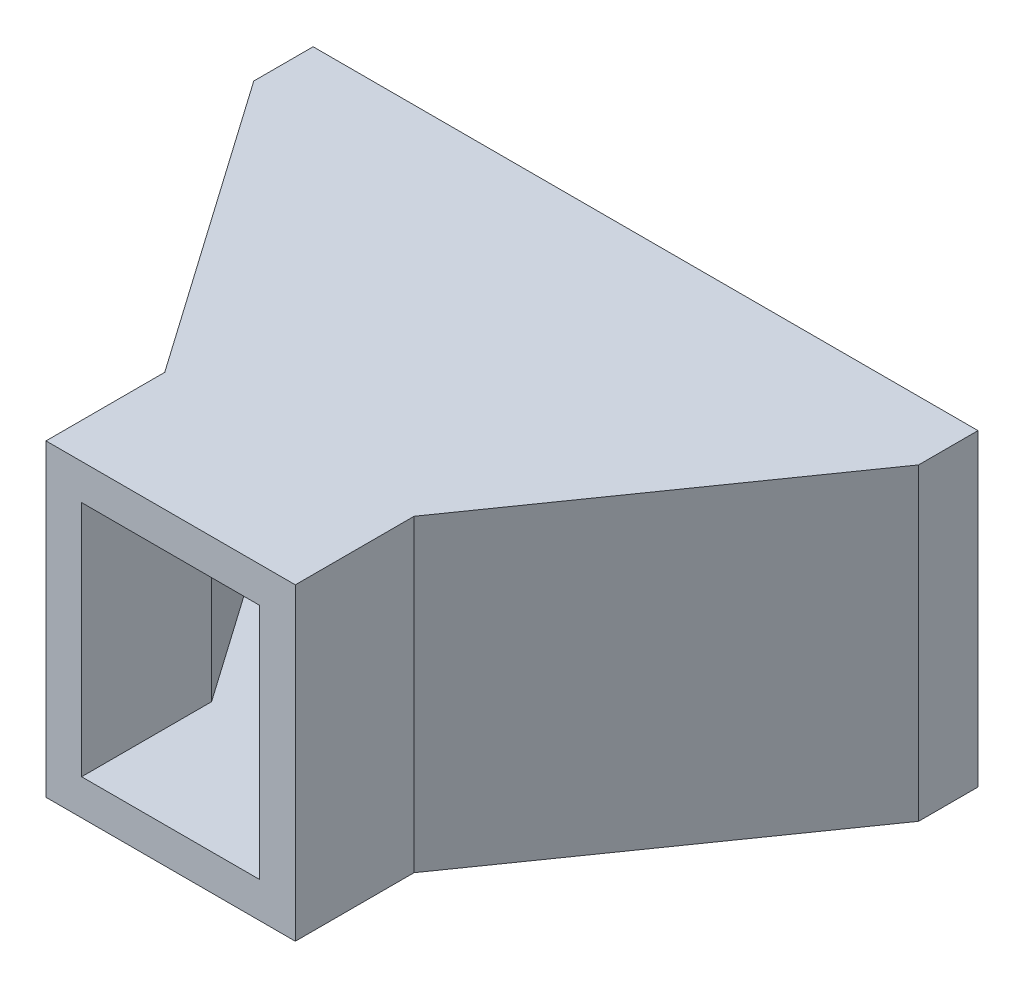
ISO-10303-21;
HEADER;
FILE_DESCRIPTION(('STEP AP214'),'2;1');
FILE_NAME('part.step','',(''),(''),'','','');
FILE_SCHEMA(('AUTOMOTIVE_DESIGN { 1 0 10303 214 1 1 1 1 }'));
ENDSEC;
DATA;
#1=APPLICATION_CONTEXT('core data for automotive mechanical design processes');
#2=APPLICATION_PROTOCOL_DEFINITION('international standard','automotive_design',2000,#1);
#3=PRODUCT_CONTEXT('',#1,'mechanical');
#4=PRODUCT('Part','Part','',(#3));
#5=PRODUCT_RELATED_PRODUCT_CATEGORY('part','',(#4));
#6=PRODUCT_DEFINITION_FORMATION('','',#4);
#7=PRODUCT_DEFINITION_CONTEXT('part definition',#1,'design');
#8=PRODUCT_DEFINITION('design','',#6,#7);
#9=PRODUCT_DEFINITION_SHAPE('','',#8);
#10=(LENGTH_UNIT() NAMED_UNIT(*) SI_UNIT(.MILLI.,.METRE.));
#11=(NAMED_UNIT(*) PLANE_ANGLE_UNIT() SI_UNIT($,.RADIAN.));
#12=(NAMED_UNIT(*) SI_UNIT($,.STERADIAN.) SOLID_ANGLE_UNIT());
#13=UNCERTAINTY_MEASURE_WITH_UNIT(LENGTH_MEASURE(1.E-05),#10,'distance_accuracy_value','');
#14=(GEOMETRIC_REPRESENTATION_CONTEXT(3) GLOBAL_UNCERTAINTY_ASSIGNED_CONTEXT((#13)) GLOBAL_UNIT_ASSIGNED_CONTEXT((#10,
#11,#12)) REPRESENTATION_CONTEXT('',''));
#15=CARTESIAN_POINT('',(0.,0.,0.));
#16=DIRECTION('',(0.,0.,1.));
#17=DIRECTION('',(1.,0.,0.));
#18=AXIS2_PLACEMENT_3D('',#15,#16,#17);
#19=CARTESIAN_POINT('',(0.,20.,0.));
#20=DIRECTION('',(0.,1.,0.));
#21=DIRECTION('',(0.,0.,1.));
#22=AXIS2_PLACEMENT_3D('',#19,#20,#21);
#23=PLANE('',#22);
#24=DIRECTION('',(0.,0.,1.));
#25=VECTOR('',#24,1.);
#26=CARTESIAN_POINT('',(7.5,20.,11.6630289597167));
#27=LINE('',#26,#25);
#28=CARTESIAN_POINT('',(7.5,20.,11.6630289597167));
#29=VERTEX_POINT('',#28);
#30=CARTESIAN_POINT('',(7.5,20.,22.608695652174));
#31=VERTEX_POINT('',#30);
#32=EDGE_CURVE('E252',#29,#31,#27,.T.);
#33=ORIENTED_EDGE('',*,*,#32,.T.);
#34=DIRECTION('',(1.,0.,0.));
#35=VECTOR('',#34,1.);
#36=CARTESIAN_POINT('',(-10.5,20.,22.608695652174));
#37=LINE('',#36,#35);
#38=CARTESIAN_POINT('',(-7.5,20.,22.608695652174));
#39=VERTEX_POINT('',#38);
#40=EDGE_CURVE('E248',#39,#31,#37,.T.);
#41=ORIENTED_EDGE('',*,*,#40,.F.);
#42=DIRECTION('',(0.,0.,-1.));
#43=VECTOR('',#42,1.);
#44=CARTESIAN_POINT('',(-7.5,20.,11.6630289597167));
#45=LINE('',#44,#43);
#46=CARTESIAN_POINT('',(-7.5,20.,11.6630289597167));
#47=VERTEX_POINT('',#46);
#48=EDGE_CURVE('E299',#39,#47,#45,.T.);
#49=ORIENTED_EDGE('',*,*,#48,.T.);
#50=DIRECTION('',(-0.573462344363329,0.,-0.81923192051904));
#51=VECTOR('',#50,1.);
#52=CARTESIAN_POINT('',(-25.,20.,-13.3369710402833));
#53=LINE('',#52,#51);
#54=CARTESIAN_POINT('',(-25.,20.,-13.3369710402833));
#55=VERTEX_POINT('',#54);
#56=EDGE_CURVE('E303',#47,#55,#53,.T.);
#57=ORIENTED_EDGE('',*,*,#56,.T.);
#58=DIRECTION('',(0.,0.,-1.));
#59=VECTOR('',#58,1.);
#60=CARTESIAN_POINT('',(-25.,20.,-17.391304347826));
#61=LINE('',#60,#59);
#62=CARTESIAN_POINT('',(-25.,20.,-17.391304347826));
#63=VERTEX_POINT('',#62);
#64=EDGE_CURVE('E308',#55,#63,#61,.T.);
#65=ORIENTED_EDGE('',*,*,#64,.T.);
#66=DIRECTION('',(-1.,0.,0.));
#67=VECTOR('',#66,1.);
#68=CARTESIAN_POINT('',(28.,20.,-17.391304347826));
#69=LINE('',#68,#67);
#70=CARTESIAN_POINT('',(25.,20.,-17.391304347826));
#71=VERTEX_POINT('',#70);
#72=EDGE_CURVE('E264',#71,#63,#69,.T.);
#73=ORIENTED_EDGE('',*,*,#72,.F.);
#74=DIRECTION('',(0.,0.,1.));
#75=VECTOR('',#74,1.);
#76=CARTESIAN_POINT('',(25.,20.,-17.391304347826));
#77=LINE('',#76,#75);
#78=CARTESIAN_POINT('',(25.,20.,-13.3369710402833));
#79=VERTEX_POINT('',#78);
#80=EDGE_CURVE('E234',#71,#79,#77,.T.);
#81=ORIENTED_EDGE('',*,*,#80,.T.);
#82=DIRECTION('',(-0.573462344363329,0.,0.81923192051904));
#83=VECTOR('',#82,1.);
#84=CARTESIAN_POINT('',(25.,20.,-13.3369710402833));
#85=LINE('',#84,#83);
#86=EDGE_CURVE('E240',#79,#29,#85,.T.);
#87=ORIENTED_EDGE('',*,*,#86,.T.);
#88=EDGE_LOOP('',(#33,#41,#49,#57,#65,#73,#81,#87));
#89=FACE_BOUND('',#88,.T.);
#90=ADVANCED_FACE('F43',(#89),#23,.F.);
#91=CARTESIAN_POINT('',(-28.,20.,-17.391304347826));
#92=DIRECTION('',(0.,0.,1.));
#93=DIRECTION('',(1.,0.,0.));
#94=AXIS2_PLACEMENT_3D('',#91,#92,#93);
#95=PLANE('',#94);
#96=DIRECTION('',(1.,0.,0.));
#97=VECTOR('',#96,1.);
#98=CARTESIAN_POINT('',(0.,-3.,-17.391304347826));
#99=LINE('',#98,#97);
#100=CARTESIAN_POINT('',(-28.,-3.,-17.391304347826));
#101=VERTEX_POINT('',#100);
#102=CARTESIAN_POINT('',(28.,-3.,-17.391304347826));
#103=VERTEX_POINT('',#102);
#104=EDGE_CURVE('E164',#101,#103,#99,.T.);
#105=ORIENTED_EDGE('',*,*,#104,.F.);
#106=DIRECTION('',(0.,-1.,0.));
#107=VECTOR('',#106,1.);
#108=CARTESIAN_POINT('',(-28.,20.,-17.391304347826));
#109=LINE('',#108,#107);
#110=CARTESIAN_POINT('',(-28.,23.,-17.391304347826));
#111=VERTEX_POINT('',#110);
#112=EDGE_CURVE('E11',#111,#101,#109,.T.);
#113=ORIENTED_EDGE('',*,*,#112,.F.);
#114=DIRECTION('',(-1.,0.,0.));
#115=VECTOR('',#114,1.);
#116=CARTESIAN_POINT('',(28.,23.,-17.391304347826));
#117=LINE('',#116,#115);
#118=CARTESIAN_POINT('',(28.,23.,-17.391304347826));
#119=VERTEX_POINT('',#118);
#120=EDGE_CURVE('E166',#119,#111,#117,.T.);
#121=ORIENTED_EDGE('',*,*,#120,.F.);
#122=DIRECTION('',(0.,-1.,0.));
#123=VECTOR('',#122,1.);
#124=CARTESIAN_POINT('',(28.,23.,-17.391304347826));
#125=LINE('',#124,#123);
#126=EDGE_CURVE('E160',#119,#103,#125,.T.);
#127=ORIENTED_EDGE('',*,*,#126,.T.);
#128=EDGE_LOOP('',(#105,#113,#121,#127));
#129=FACE_BOUND('',#128,.T.);
#130=DIRECTION('',(0.,-1.,0.));
#131=VECTOR('',#130,1.);
#132=CARTESIAN_POINT('',(-25.,20.,-17.391304347826));
#133=LINE('',#132,#131);
#134=CARTESIAN_POINT('',(-25.,0.,-17.391304347826));
#135=VERTEX_POINT('',#134);
#136=EDGE_CURVE('E312',#63,#135,#133,.T.);
#137=ORIENTED_EDGE('',*,*,#136,.T.);
#138=DIRECTION('',(1.,0.,0.));
#139=VECTOR('',#138,1.);
#140=CARTESIAN_POINT('',(0.,0.,-17.391304347826));
#141=LINE('',#140,#139);
#142=CARTESIAN_POINT('',(25.,0.,-17.391304347826));
#143=VERTEX_POINT('',#142);
#144=EDGE_CURVE('E193',#135,#143,#141,.T.);
#145=ORIENTED_EDGE('',*,*,#144,.T.);
#146=DIRECTION('',(0.,-1.,0.));
#147=VECTOR('',#146,1.);
#148=CARTESIAN_POINT('',(25.,20.,-17.391304347826));
#149=LINE('',#148,#147);
#150=EDGE_CURVE('E226',#71,#143,#149,.T.);
#151=ORIENTED_EDGE('',*,*,#150,.F.);
#152=ORIENTED_EDGE('',*,*,#72,.T.);
#153=EDGE_LOOP('',(#137,#145,#151,#152));
#154=FACE_BOUND('',#153,.T.);
#155=ADVANCED_FACE('F45',(#129,#154),#95,.F.);
#156=CARTESIAN_POINT('',(-28.,20.,-12.391304347826));
#157=DIRECTION('',(1.,0.,0.));
#158=DIRECTION('',(0.,0.,-1.));
#159=AXIS2_PLACEMENT_3D('',#156,#157,#158);
#160=PLANE('',#159);
#161=ORIENTED_EDGE('',*,*,#112,.T.);
#162=DIRECTION('',(0.,0.,-1.));
#163=VECTOR('',#162,1.);
#164=CARTESIAN_POINT('',(-28.,-3.,0.));
#165=LINE('',#164,#163);
#166=CARTESIAN_POINT('',(-28.,-3.,-12.391304347826));
#167=VERTEX_POINT('',#166);
#168=EDGE_CURVE('E187',#167,#101,#165,.T.);
#169=ORIENTED_EDGE('',*,*,#168,.F.);
#170=DIRECTION('',(0.,-1.,0.));
#171=VECTOR('',#170,1.);
#172=CARTESIAN_POINT('',(-28.,20.,-12.391304347826));
#173=LINE('',#172,#171);
#174=CARTESIAN_POINT('',(-28.,23.,-12.391304347826));
#175=VERTEX_POINT('',#174);
#176=EDGE_CURVE('E52',#175,#167,#173,.T.);
#177=ORIENTED_EDGE('',*,*,#176,.F.);
#178=DIRECTION('',(0.,0.,1.));
#179=VECTOR('',#178,1.);
#180=CARTESIAN_POINT('',(-28.,23.,-17.391304347826));
#181=LINE('',#180,#179);
#182=EDGE_CURVE('E278',#111,#175,#181,.T.);
#183=ORIENTED_EDGE('',*,*,#182,.F.);
#184=EDGE_LOOP('',(#161,#169,#177,#183));
#185=FACE_BOUND('',#184,.T.);
#186=ADVANCED_FACE('F345',(#185),#160,.F.);
#187=CARTESIAN_POINT('',(-10.5,20.,12.608695652174));
#188=DIRECTION('',(0.81923192051904,0.,-0.573462344363328));
#189=DIRECTION('',(-0.573462344363328,0.,-0.81923192051904));
#190=AXIS2_PLACEMENT_3D('',#187,#188,#189);
#191=PLANE('',#190);
#192=ORIENTED_EDGE('',*,*,#176,.T.);
#193=DIRECTION('',(-0.573462344363328,0.,-0.81923192051904));
#194=VECTOR('',#193,1.);
#195=CARTESIAN_POINT('',(-12.9705281587395,-3.,9.07936971111764));
#196=LINE('',#195,#194);
#197=CARTESIAN_POINT('',(-10.5,-3.,12.608695652174));
#198=VERTEX_POINT('',#197);
#199=EDGE_CURVE('E210',#198,#167,#196,.T.);
#200=ORIENTED_EDGE('',*,*,#199,.F.);
#201=DIRECTION('',(0.,-1.,0.));
#202=VECTOR('',#201,1.);
#203=CARTESIAN_POINT('',(-10.5,20.,12.608695652174));
#204=LINE('',#203,#202);
#205=CARTESIAN_POINT('',(-10.5,23.,12.608695652174));
#206=VERTEX_POINT('',#205);
#207=EDGE_CURVE('E335',#206,#198,#204,.T.);
#208=ORIENTED_EDGE('',*,*,#207,.F.);
#209=DIRECTION('',(0.573462344363328,0.,0.81923192051904));
#210=VECTOR('',#209,1.);
#211=CARTESIAN_POINT('',(-28.,23.,-12.391304347826));
#212=LINE('',#211,#210);
#213=EDGE_CURVE('E171',#175,#206,#212,.T.);
#214=ORIENTED_EDGE('',*,*,#213,.F.);
#215=EDGE_LOOP('',(#192,#200,#208,#214));
#216=FACE_BOUND('',#215,.T.);
#217=ADVANCED_FACE('F341',(#216),#191,.F.);
#218=CARTESIAN_POINT('',(-10.5,20.,22.608695652174));
#219=DIRECTION('',(1.,0.,0.));
#220=DIRECTION('',(0.,0.,-1.));
#221=AXIS2_PLACEMENT_3D('',#218,#219,#220);
#222=PLANE('',#221);
#223=ORIENTED_EDGE('',*,*,#207,.T.);
#224=DIRECTION('',(0.,0.,-1.));
#225=VECTOR('',#224,1.);
#226=CARTESIAN_POINT('',(-10.5,-3.,0.));
#227=LINE('',#226,#225);
#228=CARTESIAN_POINT('',(-10.5,-3.,22.608695652174));
#229=VERTEX_POINT('',#228);
#230=EDGE_CURVE('E206',#229,#198,#227,.T.);
#231=ORIENTED_EDGE('',*,*,#230,.F.);
#232=DIRECTION('',(0.,-1.,0.));
#233=VECTOR('',#232,1.);
#234=CARTESIAN_POINT('',(-10.5,20.,22.608695652174));
#235=LINE('',#234,#233);
#236=CARTESIAN_POINT('',(-10.5,23.,22.608695652174));
#237=VERTEX_POINT('',#236);
#238=EDGE_CURVE('E332',#237,#229,#235,.T.);
#239=ORIENTED_EDGE('',*,*,#238,.F.);
#240=DIRECTION('',(0.,0.,1.));
#241=VECTOR('',#240,1.);
#242=CARTESIAN_POINT('',(-10.5,23.,12.608695652174));
#243=LINE('',#242,#241);
#244=EDGE_CURVE('E259',#206,#237,#243,.T.);
#245=ORIENTED_EDGE('',*,*,#244,.F.);
#246=EDGE_LOOP('',(#223,#231,#239,#245));
#247=FACE_BOUND('',#246,.T.);
#248=ADVANCED_FACE('F362',(#247),#222,.F.);
#249=CARTESIAN_POINT('',(-7.5,20.,22.608695652174));
#250=DIRECTION('',(0.,0.,-1.));
#251=DIRECTION('',(-1.,0.,0.));
#252=AXIS2_PLACEMENT_3D('',#249,#250,#251);
#253=PLANE('',#252);
#254=DIRECTION('',(-1.,0.,0.));
#255=VECTOR('',#254,1.);
#256=CARTESIAN_POINT('',(0.,0.,22.608695652174));
#257=LINE('',#256,#255);
#258=CARTESIAN_POINT('',(7.5,0.,22.608695652174));
#259=VERTEX_POINT('',#258);
#260=CARTESIAN_POINT('',(-7.5,0.,22.608695652174));
#261=VERTEX_POINT('',#260);
#262=EDGE_CURVE('E189',#259,#261,#257,.T.);
#263=ORIENTED_EDGE('',*,*,#262,.T.);
#264=DIRECTION('',(0.,-1.,0.));
#265=VECTOR('',#264,1.);
#266=CARTESIAN_POINT('',(-7.5,20.,22.608695652174));
#267=LINE('',#266,#265);
#268=EDGE_CURVE('E328',#39,#261,#267,.T.);
#269=ORIENTED_EDGE('',*,*,#268,.F.);
#270=ORIENTED_EDGE('',*,*,#40,.T.);
#271=DIRECTION('',(0.,-1.,0.));
#272=VECTOR('',#271,1.);
#273=CARTESIAN_POINT('',(7.5,20.,22.608695652174));
#274=LINE('',#273,#272);
#275=EDGE_CURVE('E222',#31,#259,#274,.T.);
#276=ORIENTED_EDGE('',*,*,#275,.T.);
#277=EDGE_LOOP('',(#263,#269,#270,#276));
#278=FACE_BOUND('',#277,.T.);
#279=ORIENTED_EDGE('',*,*,#238,.T.);
#280=DIRECTION('',(-1.,0.,0.));
#281=VECTOR('',#280,1.);
#282=CARTESIAN_POINT('',(0.,-3.,22.608695652174));
#283=LINE('',#282,#281);
#284=CARTESIAN_POINT('',(10.5,-3.,22.608695652174));
#285=VERTEX_POINT('',#284);
#286=EDGE_CURVE('E202',#285,#229,#283,.T.);
#287=ORIENTED_EDGE('',*,*,#286,.F.);
#288=DIRECTION('',(0.,-1.,0.));
#289=VECTOR('',#288,1.);
#290=CARTESIAN_POINT('',(10.5,23.,22.608695652174));
#291=LINE('',#290,#289);
#292=CARTESIAN_POINT('',(10.5,23.,22.608695652174));
#293=VERTEX_POINT('',#292);
#294=EDGE_CURVE('E295',#293,#285,#291,.T.);
#295=ORIENTED_EDGE('',*,*,#294,.F.);
#296=DIRECTION('',(1.,0.,0.));
#297=VECTOR('',#296,1.);
#298=CARTESIAN_POINT('',(-10.5,23.,22.608695652174));
#299=LINE('',#298,#297);
#300=EDGE_CURVE('E263',#237,#293,#299,.T.);
#301=ORIENTED_EDGE('',*,*,#300,.F.);
#302=EDGE_LOOP('',(#279,#287,#295,#301));
#303=FACE_BOUND('',#302,.T.);
#304=ADVANCED_FACE('F360',(#278,#303),#253,.F.);
#305=CARTESIAN_POINT('',(-7.5,20.,11.6630289597167));
#306=DIRECTION('',(-1.,0.,0.));
#307=DIRECTION('',(0.,0.,1.));
#308=AXIS2_PLACEMENT_3D('',#305,#306,#307);
#309=PLANE('',#308);
#310=DIRECTION('',(0.,0.,-1.));
#311=VECTOR('',#310,1.);
#312=CARTESIAN_POINT('',(-7.5,0.,11.6630289597167));
#313=LINE('',#312,#311);
#314=CARTESIAN_POINT('',(-7.5,0.,11.6630289597167));
#315=VERTEX_POINT('',#314);
#316=EDGE_CURVE('E298',#261,#315,#313,.T.);
#317=ORIENTED_EDGE('',*,*,#316,.T.);
#318=DIRECTION('',(0.,-1.,0.));
#319=VECTOR('',#318,1.);
#320=CARTESIAN_POINT('',(-7.5,20.,11.6630289597167));
#321=LINE('',#320,#319);
#322=EDGE_CURVE('E67',#47,#315,#321,.T.);
#323=ORIENTED_EDGE('',*,*,#322,.F.);
#324=ORIENTED_EDGE('',*,*,#48,.F.);
#325=ORIENTED_EDGE('',*,*,#268,.T.);
#326=EDGE_LOOP('',(#317,#323,#324,#325));
#327=FACE_BOUND('',#326,.T.);
#328=ADVANCED_FACE('F370',(#327),#309,.F.);
#329=CARTESIAN_POINT('',(-25.,20.,-13.3369710402833));
#330=DIRECTION('',(-0.81923192051904,0.,0.573462344363329));
#331=DIRECTION('',(0.573462344363329,0.,0.81923192051904));
#332=AXIS2_PLACEMENT_3D('',#329,#330,#331);
#333=PLANE('',#332);
#334=DIRECTION('',(-0.573462344363329,0.,-0.81923192051904));
#335=VECTOR('',#334,1.);
#336=CARTESIAN_POINT('',(-25.,0.,-13.3369710402833));
#337=LINE('',#336,#335);
#338=CARTESIAN_POINT('',(-25.,0.,-13.3369710402833));
#339=VERTEX_POINT('',#338);
#340=EDGE_CURVE('E315',#315,#339,#337,.T.);
#341=ORIENTED_EDGE('',*,*,#340,.T.);
#342=DIRECTION('',(0.,-1.,0.));
#343=VECTOR('',#342,1.);
#344=CARTESIAN_POINT('',(-25.,20.,-13.3369710402833));
#345=LINE('',#344,#343);
#346=EDGE_CURVE('E59',#55,#339,#345,.T.);
#347=ORIENTED_EDGE('',*,*,#346,.F.);
#348=ORIENTED_EDGE('',*,*,#56,.F.);
#349=ORIENTED_EDGE('',*,*,#322,.T.);
#350=EDGE_LOOP('',(#341,#347,#348,#349));
#351=FACE_BOUND('',#350,.T.);
#352=ADVANCED_FACE('F392',(#351),#333,.F.);
#353=CARTESIAN_POINT('',(-25.,20.,-17.391304347826));
#354=DIRECTION('',(-1.,0.,0.));
#355=DIRECTION('',(0.,0.,1.));
#356=AXIS2_PLACEMENT_3D('',#353,#354,#355);
#357=PLANE('',#356);
#358=DIRECTION('',(0.,0.,-1.));
#359=VECTOR('',#358,1.);
#360=CARTESIAN_POINT('',(-25.,0.,-17.391304347826));
#361=LINE('',#360,#359);
#362=EDGE_CURVE('E304',#339,#135,#361,.T.);
#363=ORIENTED_EDGE('',*,*,#362,.T.);
#364=ORIENTED_EDGE('',*,*,#136,.F.);
#365=ORIENTED_EDGE('',*,*,#64,.F.);
#366=ORIENTED_EDGE('',*,*,#346,.T.);
#367=EDGE_LOOP('',(#363,#364,#365,#366));
#368=FACE_BOUND('',#367,.T.);
#369=ADVANCED_FACE('F389',(#368),#357,.F.);
#370=CARTESIAN_POINT('',(10.5,23.,22.608695652174));
#371=DIRECTION('',(-1.,0.,0.));
#372=DIRECTION('',(0.,0.,1.));
#373=AXIS2_PLACEMENT_3D('',#370,#371,#372);
#374=PLANE('',#373);
#375=ORIENTED_EDGE('',*,*,#294,.T.);
#376=DIRECTION('',(0.,0.,1.));
#377=VECTOR('',#376,1.);
#378=CARTESIAN_POINT('',(10.5,-3.,0.));
#379=LINE('',#378,#377);
#380=CARTESIAN_POINT('',(10.5,-3.,12.608695652174));
#381=VERTEX_POINT('',#380);
#382=EDGE_CURVE('E198',#381,#285,#379,.T.);
#383=ORIENTED_EDGE('',*,*,#382,.F.);
#384=DIRECTION('',(0.,-1.,0.));
#385=VECTOR('',#384,1.);
#386=CARTESIAN_POINT('',(10.5,23.,12.608695652174));
#387=LINE('',#386,#385);
#388=CARTESIAN_POINT('',(10.5,23.,12.608695652174));
#389=VERTEX_POINT('',#388);
#390=EDGE_CURVE('E292',#389,#381,#387,.T.);
#391=ORIENTED_EDGE('',*,*,#390,.F.);
#392=DIRECTION('',(0.,0.,-1.));
#393=VECTOR('',#392,1.);
#394=CARTESIAN_POINT('',(10.5,23.,22.608695652174));
#395=LINE('',#394,#393);
#396=EDGE_CURVE('E267',#293,#389,#395,.T.);
#397=ORIENTED_EDGE('',*,*,#396,.F.);
#398=EDGE_LOOP('',(#375,#383,#391,#397));
#399=FACE_BOUND('',#398,.T.);
#400=ADVANCED_FACE('F356',(#399),#374,.F.);
#401=CARTESIAN_POINT('',(10.5,23.,12.608695652174));
#402=DIRECTION('',(-0.81923192051904,0.,-0.573462344363328));
#403=DIRECTION('',(-0.573462344363328,0.,0.819231920519041));
#404=AXIS2_PLACEMENT_3D('',#401,#402,#403);
#405=PLANE('',#404);
#406=ORIENTED_EDGE('',*,*,#390,.T.);
#407=DIRECTION('',(-0.573462344363328,0.,0.81923192051904));
#408=VECTOR('',#407,1.);
#409=CARTESIAN_POINT('',(12.9705281587395,-3.,9.07936971111764));
#410=LINE('',#409,#408);
#411=CARTESIAN_POINT('',(28.,-3.,-12.391304347826));
#412=VERTEX_POINT('',#411);
#413=EDGE_CURVE('E181',#412,#381,#410,.T.);
#414=ORIENTED_EDGE('',*,*,#413,.F.);
#415=DIRECTION('',(0.,-1.,0.));
#416=VECTOR('',#415,1.);
#417=CARTESIAN_POINT('',(28.,23.,-12.391304347826));
#418=LINE('',#417,#416);
#419=CARTESIAN_POINT('',(28.,23.,-12.391304347826));
#420=VERTEX_POINT('',#419);
#421=EDGE_CURVE('E170',#420,#412,#418,.T.);
#422=ORIENTED_EDGE('',*,*,#421,.F.);
#423=DIRECTION('',(0.573462344363328,0.,-0.81923192051904));
#424=VECTOR('',#423,1.);
#425=CARTESIAN_POINT('',(10.5,23.,12.608695652174));
#426=LINE('',#425,#424);
#427=EDGE_CURVE('E270',#389,#420,#426,.T.);
#428=ORIENTED_EDGE('',*,*,#427,.F.);
#429=EDGE_LOOP('',(#406,#414,#422,#428));
#430=FACE_BOUND('',#429,.T.);
#431=ADVANCED_FACE('F352',(#430),#405,.F.);
#432=CARTESIAN_POINT('',(28.,23.,-12.391304347826));
#433=DIRECTION('',(-1.,0.,0.));
#434=DIRECTION('',(0.,0.,1.));
#435=AXIS2_PLACEMENT_3D('',#432,#433,#434);
#436=PLANE('',#435);
#437=ORIENTED_EDGE('',*,*,#421,.T.);
#438=DIRECTION('',(0.,0.,1.));
#439=VECTOR('',#438,1.);
#440=CARTESIAN_POINT('',(28.,-3.,0.));
#441=LINE('',#440,#439);
#442=EDGE_CURVE('E174',#103,#412,#441,.T.);
#443=ORIENTED_EDGE('',*,*,#442,.F.);
#444=ORIENTED_EDGE('',*,*,#126,.F.);
#445=DIRECTION('',(0.,0.,-1.));
#446=VECTOR('',#445,1.);
#447=CARTESIAN_POINT('',(28.,23.,-12.391304347826));
#448=LINE('',#447,#446);
#449=EDGE_CURVE('E273',#420,#119,#448,.T.);
#450=ORIENTED_EDGE('',*,*,#449,.F.);
#451=EDGE_LOOP('',(#437,#443,#444,#450));
#452=FACE_BOUND('',#451,.T.);
#453=ADVANCED_FACE('F175',(#452),#436,.F.);
#454=CARTESIAN_POINT('',(0.,23.,0.));
#455=DIRECTION('',(0.,1.,0.));
#456=DIRECTION('',(0.,0.,1.));
#457=AXIS2_PLACEMENT_3D('',#454,#455,#456);
#458=PLANE('',#457);
#459=ORIENTED_EDGE('',*,*,#244,.T.);
#460=ORIENTED_EDGE('',*,*,#300,.T.);
#461=ORIENTED_EDGE('',*,*,#396,.T.);
#462=ORIENTED_EDGE('',*,*,#427,.T.);
#463=ORIENTED_EDGE('',*,*,#449,.T.);
#464=ORIENTED_EDGE('',*,*,#120,.T.);
#465=ORIENTED_EDGE('',*,*,#182,.T.);
#466=ORIENTED_EDGE('',*,*,#213,.T.);
#467=EDGE_LOOP('',(#459,#460,#461,#462,#463,#464,#465,#466));
#468=FACE_BOUND('',#467,.T.);
#469=ADVANCED_FACE('F347',(#468),#458,.T.);
#470=CARTESIAN_POINT('',(25.,20.,-13.3369710402833));
#471=DIRECTION('',(0.81923192051904,0.,0.573462344363329));
#472=DIRECTION('',(0.573462344363329,0.,-0.81923192051904));
#473=AXIS2_PLACEMENT_3D('',#470,#471,#472);
#474=PLANE('',#473);
#475=DIRECTION('',(-0.573462344363329,0.,0.81923192051904));
#476=VECTOR('',#475,1.);
#477=CARTESIAN_POINT('',(25.,0.,-13.3369710402833));
#478=LINE('',#477,#476);
#479=CARTESIAN_POINT('',(25.,0.,-13.3369710402833));
#480=VERTEX_POINT('',#479);
#481=CARTESIAN_POINT('',(7.5,0.,11.6630289597167));
#482=VERTEX_POINT('',#481);
#483=EDGE_CURVE('E244',#480,#482,#478,.T.);
#484=ORIENTED_EDGE('',*,*,#483,.T.);
#485=DIRECTION('',(0.,-1.,0.));
#486=VECTOR('',#485,1.);
#487=CARTESIAN_POINT('',(7.5,20.,11.6630289597167));
#488=LINE('',#487,#486);
#489=EDGE_CURVE('E215',#29,#482,#488,.T.);
#490=ORIENTED_EDGE('',*,*,#489,.F.);
#491=ORIENTED_EDGE('',*,*,#86,.F.);
#492=DIRECTION('',(0.,-1.,0.));
#493=VECTOR('',#492,1.);
#494=CARTESIAN_POINT('',(25.,20.,-13.3369710402833));
#495=LINE('',#494,#493);
#496=EDGE_CURVE('E230',#79,#480,#495,.T.);
#497=ORIENTED_EDGE('',*,*,#496,.T.);
#498=EDGE_LOOP('',(#484,#490,#491,#497));
#499=FACE_BOUND('',#498,.T.);
#500=ADVANCED_FACE('F407',(#499),#474,.F.);
#501=CARTESIAN_POINT('',(7.5,20.,11.6630289597167));
#502=DIRECTION('',(1.,0.,0.));
#503=DIRECTION('',(0.,0.,-1.));
#504=AXIS2_PLACEMENT_3D('',#501,#502,#503);
#505=PLANE('',#504);
#506=DIRECTION('',(0.,0.,1.));
#507=VECTOR('',#506,1.);
#508=CARTESIAN_POINT('',(7.5,0.,11.6630289597167));
#509=LINE('',#508,#507);
#510=EDGE_CURVE('E239',#482,#259,#509,.T.);
#511=ORIENTED_EDGE('',*,*,#510,.T.);
#512=ORIENTED_EDGE('',*,*,#275,.F.);
#513=ORIENTED_EDGE('',*,*,#32,.F.);
#514=ORIENTED_EDGE('',*,*,#489,.T.);
#515=EDGE_LOOP('',(#511,#512,#513,#514));
#516=FACE_BOUND('',#515,.T.);
#517=ADVANCED_FACE('F403',(#516),#505,.F.);
#518=CARTESIAN_POINT('',(25.,20.,-17.391304347826));
#519=DIRECTION('',(1.,0.,0.));
#520=DIRECTION('',(0.,0.,-1.));
#521=AXIS2_PLACEMENT_3D('',#518,#519,#520);
#522=PLANE('',#521);
#523=DIRECTION('',(0.,0.,1.));
#524=VECTOR('',#523,1.);
#525=CARTESIAN_POINT('',(25.,0.,-17.391304347826));
#526=LINE('',#525,#524);
#527=EDGE_CURVE('E235',#143,#480,#526,.T.);
#528=ORIENTED_EDGE('',*,*,#527,.T.);
#529=ORIENTED_EDGE('',*,*,#496,.F.);
#530=ORIENTED_EDGE('',*,*,#80,.F.);
#531=ORIENTED_EDGE('',*,*,#150,.T.);
#532=EDGE_LOOP('',(#528,#529,#530,#531));
#533=FACE_BOUND('',#532,.T.);
#534=ADVANCED_FACE('F409',(#533),#522,.F.);
#535=CARTESIAN_POINT('',(0.,0.,0.));
#536=DIRECTION('',(0.,-1.,0.));
#537=DIRECTION('',(0.,0.,-1.));
#538=AXIS2_PLACEMENT_3D('',#535,#536,#537);
#539=PLANE('',#538);
#540=ORIENTED_EDGE('',*,*,#340,.F.);
#541=ORIENTED_EDGE('',*,*,#316,.F.);
#542=ORIENTED_EDGE('',*,*,#262,.F.);
#543=ORIENTED_EDGE('',*,*,#510,.F.);
#544=ORIENTED_EDGE('',*,*,#483,.F.);
#545=ORIENTED_EDGE('',*,*,#527,.F.);
#546=ORIENTED_EDGE('',*,*,#144,.F.);
#547=ORIENTED_EDGE('',*,*,#362,.F.);
#548=EDGE_LOOP('',(#540,#541,#542,#543,#544,#545,#546,#547));
#549=FACE_BOUND('',#548,.T.);
#550=ADVANCED_FACE('F401',(#549),#539,.F.);
#551=CARTESIAN_POINT('',(0.,-3.,0.));
#552=DIRECTION('',(0.,-1.,0.));
#553=DIRECTION('',(0.,0.,-1.));
#554=AXIS2_PLACEMENT_3D('',#551,#552,#553);
#555=PLANE('',#554);
#556=ORIENTED_EDGE('',*,*,#104,.T.);
#557=ORIENTED_EDGE('',*,*,#442,.T.);
#558=ORIENTED_EDGE('',*,*,#413,.T.);
#559=ORIENTED_EDGE('',*,*,#382,.T.);
#560=ORIENTED_EDGE('',*,*,#286,.T.);
#561=ORIENTED_EDGE('',*,*,#230,.T.);
#562=ORIENTED_EDGE('',*,*,#199,.T.);
#563=ORIENTED_EDGE('',*,*,#168,.T.);
#564=EDGE_LOOP('',(#556,#557,#558,#559,#560,#561,#562,#563));
#565=FACE_BOUND('',#564,.T.);
#566=ADVANCED_FACE('F184',(#565),#555,.T.);
#567=CLOSED_SHELL('',(#90,#155,#186,#217,#248,#304,#328,#352,#369,#400,#431,#453,#469,#500,#517,
#534,#550,#566));
#568=MANIFOLD_SOLID_BREP('B2',#567);
#569=ADVANCED_BREP_SHAPE_REPRESENTATION('',(#18,#568),#14);
#570=SHAPE_DEFINITION_REPRESENTATION(#9,#569);
ENDSEC;
END-ISO-10303-21;
